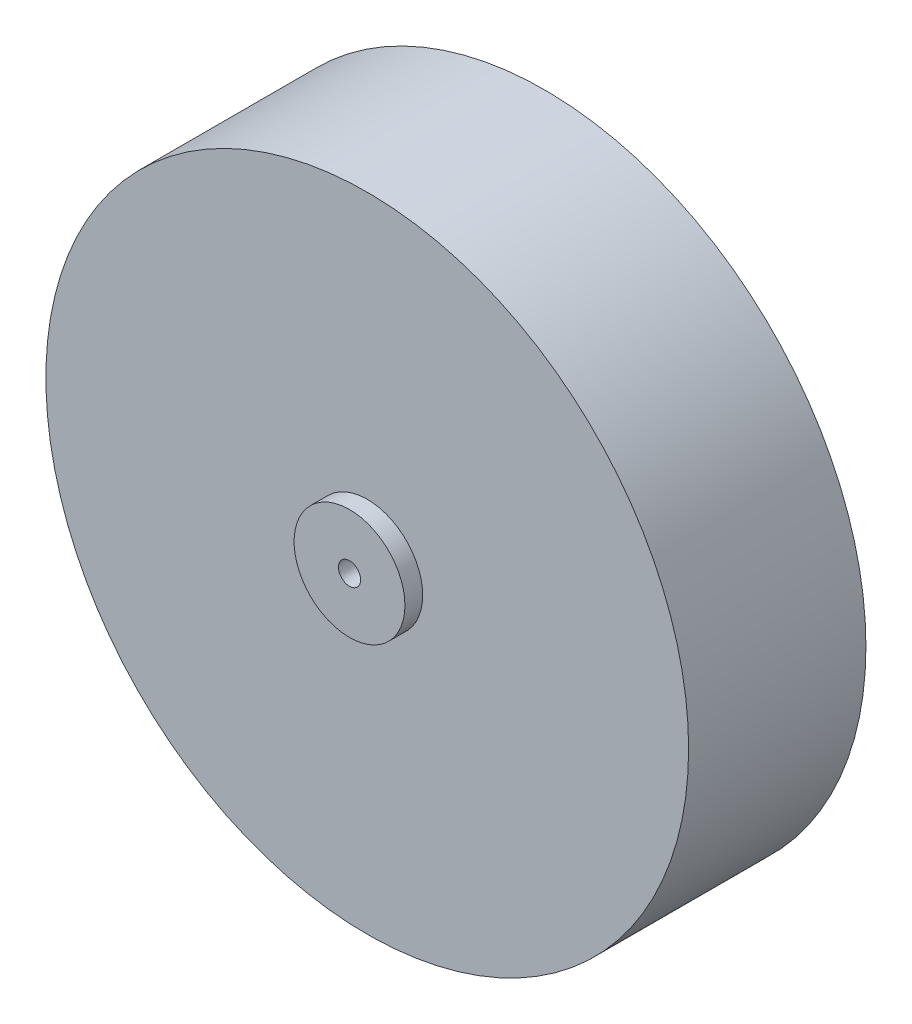
ISO-10303-21;
HEADER;
FILE_DESCRIPTION(('STEP AP214'),'2;1');
FILE_NAME('part.step','',(''),(''),'','','');
FILE_SCHEMA(('AUTOMOTIVE_DESIGN { 1 0 10303 214 1 1 1 1 }'));
ENDSEC;
DATA;
#1=APPLICATION_CONTEXT('core data for automotive mechanical design processes');
#2=APPLICATION_PROTOCOL_DEFINITION('international standard','automotive_design',2000,#1);
#3=PRODUCT_CONTEXT('',#1,'mechanical');
#4=PRODUCT('Part','Part','',(#3));
#5=PRODUCT_RELATED_PRODUCT_CATEGORY('part','',(#4));
#6=PRODUCT_DEFINITION_FORMATION('','',#4);
#7=PRODUCT_DEFINITION_CONTEXT('part definition',#1,'design');
#8=PRODUCT_DEFINITION('design','',#6,#7);
#9=PRODUCT_DEFINITION_SHAPE('','',#8);
#10=(LENGTH_UNIT() NAMED_UNIT(*) SI_UNIT(.MILLI.,.METRE.));
#11=(NAMED_UNIT(*) PLANE_ANGLE_UNIT() SI_UNIT($,.RADIAN.));
#12=(NAMED_UNIT(*) SI_UNIT($,.STERADIAN.) SOLID_ANGLE_UNIT());
#13=UNCERTAINTY_MEASURE_WITH_UNIT(LENGTH_MEASURE(1.E-05),#10,'distance_accuracy_value','');
#14=(GEOMETRIC_REPRESENTATION_CONTEXT(3) GLOBAL_UNCERTAINTY_ASSIGNED_CONTEXT((#13)) GLOBAL_UNIT_ASSIGNED_CONTEXT((#10,
#11,#12)) REPRESENTATION_CONTEXT('',''));
#15=CARTESIAN_POINT('',(0.,0.,0.));
#16=DIRECTION('',(0.,0.,1.));
#17=DIRECTION('',(1.,0.,0.));
#18=AXIS2_PLACEMENT_3D('',#15,#16,#17);
#19=CARTESIAN_POINT('',(0.,0.,20.));
#20=DIRECTION('',(0.,0.,-1.));
#21=DIRECTION('',(-1.,0.,0.));
#22=AXIS2_PLACEMENT_3D('',#19,#20,#21);
#23=CYLINDRICAL_SURFACE('',#22,72.5);
#24=CARTESIAN_POINT('',(0.,0.,20.));
#25=DIRECTION('',(0.,0.,1.));
#26=DIRECTION('',(1.,0.,0.));
#27=AXIS2_PLACEMENT_3D('',#24,#25,#26);
#28=CIRCLE('',#27,72.5);
#29=CARTESIAN_POINT('',(72.5,0.,20.));
#30=VERTEX_POINT('',#29);
#31=EDGE_CURVE('E47',#30,#30,#28,.T.);
#32=ORIENTED_EDGE('',*,*,#31,.F.);
#33=EDGE_LOOP('',(#32));
#34=FACE_BOUND('',#33,.T.);
#35=CARTESIAN_POINT('',(0.,0.,-20.));
#36=DIRECTION('',(0.,0.,1.));
#37=DIRECTION('',(1.,0.,0.));
#38=AXIS2_PLACEMENT_3D('',#35,#36,#37);
#39=CIRCLE('',#38,72.5);
#40=CARTESIAN_POINT('',(72.5,0.,-20.));
#41=VERTEX_POINT('',#40);
#42=EDGE_CURVE('E42',#41,#41,#39,.T.);
#43=ORIENTED_EDGE('',*,*,#42,.T.);
#44=EDGE_LOOP('',(#43));
#45=FACE_BOUND('',#44,.T.);
#46=ADVANCED_FACE('F39',(#34,#45),#23,.T.);
#47=CARTESIAN_POINT('',(0.,0.,20.));
#48=DIRECTION('',(0.,0.,1.));
#49=DIRECTION('',(1.,0.,0.));
#50=AXIS2_PLACEMENT_3D('',#47,#48,#49);
#51=PLANE('',#50);
#52=CARTESIAN_POINT('',(0.,0.,20.));
#53=DIRECTION('',(0.,0.,1.));
#54=DIRECTION('',(1.,0.,0.));
#55=AXIS2_PLACEMENT_3D('',#52,#53,#54);
#56=CIRCLE('',#55,12.5);
#57=CARTESIAN_POINT('',(12.5,0.,20.));
#58=VERTEX_POINT('',#57);
#59=EDGE_CURVE('E10',#58,#58,#56,.T.);
#60=ORIENTED_EDGE('',*,*,#59,.F.);
#61=EDGE_LOOP('',(#60));
#62=FACE_BOUND('',#61,.T.);
#63=ORIENTED_EDGE('',*,*,#31,.T.);
#64=EDGE_LOOP('',(#63));
#65=FACE_BOUND('',#64,.T.);
#66=ADVANCED_FACE('F94',(#62,#65),#51,.T.);
#67=CARTESIAN_POINT('',(0.,0.,-20.));
#68=DIRECTION('',(0.,0.,1.));
#69=DIRECTION('',(1.,0.,0.));
#70=AXIS2_PLACEMENT_3D('',#67,#68,#69);
#71=PLANE('',#70);
#72=CARTESIAN_POINT('',(0.,0.,-20.));
#73=DIRECTION('',(0.,0.,1.));
#74=DIRECTION('',(1.,0.,0.));
#75=AXIS2_PLACEMENT_3D('',#72,#73,#74);
#76=CIRCLE('',#75,12.5);
#77=CARTESIAN_POINT('',(12.5,0.,-20.));
#78=VERTEX_POINT('',#77);
#79=EDGE_CURVE('E59',#78,#78,#76,.T.);
#80=ORIENTED_EDGE('',*,*,#79,.T.);
#81=EDGE_LOOP('',(#80));
#82=FACE_BOUND('',#81,.T.);
#83=ORIENTED_EDGE('',*,*,#42,.F.);
#84=EDGE_LOOP('',(#83));
#85=FACE_BOUND('',#84,.T.);
#86=ADVANCED_FACE('F90',(#82,#85),#71,.F.);
#87=CARTESIAN_POINT('',(0.,0.,24.));
#88=DIRECTION('',(0.,0.,-1.));
#89=DIRECTION('',(-1.,0.,0.));
#90=AXIS2_PLACEMENT_3D('',#87,#88,#89);
#91=CYLINDRICAL_SURFACE('',#90,12.5);
#92=CARTESIAN_POINT('',(0.,0.,24.));
#93=DIRECTION('',(0.,0.,1.));
#94=DIRECTION('',(1.,0.,0.));
#95=AXIS2_PLACEMENT_3D('',#92,#93,#94);
#96=CIRCLE('',#95,12.5);
#97=CARTESIAN_POINT('',(12.5,0.,24.));
#98=VERTEX_POINT('',#97);
#99=EDGE_CURVE('E54',#98,#98,#96,.T.);
#100=ORIENTED_EDGE('',*,*,#99,.F.);
#101=EDGE_LOOP('',(#100));
#102=FACE_BOUND('',#101,.T.);
#103=ORIENTED_EDGE('',*,*,#59,.T.);
#104=EDGE_LOOP('',(#103));
#105=FACE_BOUND('',#104,.T.);
#106=ADVANCED_FACE('F93',(#102,#105),#91,.T.);
#107=CARTESIAN_POINT('',(0.,0.,24.));
#108=DIRECTION('',(0.,0.,1.));
#109=DIRECTION('',(1.,0.,0.));
#110=AXIS2_PLACEMENT_3D('',#107,#108,#109);
#111=PLANE('',#110);
#112=CARTESIAN_POINT('',(0.,0.,24.));
#113=DIRECTION('',(0.,0.,1.));
#114=DIRECTION('',(1.,0.,0.));
#115=AXIS2_PLACEMENT_3D('',#112,#113,#114);
#116=CIRCLE('',#115,2.5);
#117=CARTESIAN_POINT('',(2.5,0.,24.));
#118=VERTEX_POINT('',#117);
#119=EDGE_CURVE('E67',#118,#118,#116,.T.);
#120=ORIENTED_EDGE('',*,*,#119,.F.);
#121=EDGE_LOOP('',(#120));
#122=FACE_BOUND('',#121,.T.);
#123=ORIENTED_EDGE('',*,*,#99,.T.);
#124=EDGE_LOOP('',(#123));
#125=FACE_BOUND('',#124,.T.);
#126=ADVANCED_FACE('F86',(#122,#125),#111,.T.);
#127=CARTESIAN_POINT('',(0.,0.,-24.));
#128=DIRECTION('',(0.,0.,1.));
#129=DIRECTION('',(1.,0.,0.));
#130=AXIS2_PLACEMENT_3D('',#127,#128,#129);
#131=CYLINDRICAL_SURFACE('',#130,12.5);
#132=CARTESIAN_POINT('',(0.,0.,-24.));
#133=DIRECTION('',(0.,0.,1.));
#134=DIRECTION('',(1.,0.,0.));
#135=AXIS2_PLACEMENT_3D('',#132,#133,#134);
#136=CIRCLE('',#135,12.5);
#137=CARTESIAN_POINT('',(12.5,0.,-24.));
#138=VERTEX_POINT('',#137);
#139=EDGE_CURVE('E58',#138,#138,#136,.T.);
#140=ORIENTED_EDGE('',*,*,#139,.T.);
#141=EDGE_LOOP('',(#140));
#142=FACE_BOUND('',#141,.T.);
#143=ORIENTED_EDGE('',*,*,#79,.F.);
#144=EDGE_LOOP('',(#143));
#145=FACE_BOUND('',#144,.T.);
#146=ADVANCED_FACE('F80',(#142,#145),#131,.T.);
#147=CARTESIAN_POINT('',(0.,0.,-24.));
#148=DIRECTION('',(0.,0.,-1.));
#149=DIRECTION('',(1.,0.,0.));
#150=AXIS2_PLACEMENT_3D('',#147,#148,#149);
#151=PLANE('',#150);
#152=CARTESIAN_POINT('',(0.,0.,-24.));
#153=DIRECTION('',(0.,0.,-1.));
#154=DIRECTION('',(-1.,0.,0.));
#155=AXIS2_PLACEMENT_3D('',#152,#153,#154);
#156=CIRCLE('',#155,2.5);
#157=CARTESIAN_POINT('',(-2.5,0.,-24.));
#158=VERTEX_POINT('',#157);
#159=EDGE_CURVE('E63',#158,#158,#156,.T.);
#160=ORIENTED_EDGE('',*,*,#159,.F.);
#161=EDGE_LOOP('',(#160));
#162=FACE_BOUND('',#161,.T.);
#163=ORIENTED_EDGE('',*,*,#139,.F.);
#164=EDGE_LOOP('',(#163));
#165=FACE_BOUND('',#164,.T.);
#166=ADVANCED_FACE('F77',(#162,#165),#151,.T.);
#167=CARTESIAN_POINT('',(0.,0.,-24.));
#168=DIRECTION('',(0.,0.,1.));
#169=DIRECTION('',(1.,0.,0.));
#170=AXIS2_PLACEMENT_3D('',#167,#168,#169);
#171=CYLINDRICAL_SURFACE('',#170,2.5);
#172=ORIENTED_EDGE('',*,*,#119,.T.);
#173=EDGE_LOOP('',(#172));
#174=FACE_BOUND('',#173,.T.);
#175=ORIENTED_EDGE('',*,*,#159,.T.);
#176=EDGE_LOOP('',(#175));
#177=FACE_BOUND('',#176,.T.);
#178=ADVANCED_FACE('F75',(#174,#177),#171,.F.);
#179=CLOSED_SHELL('',(#46,#66,#86,#106,#126,#146,#166,#178));
#180=MANIFOLD_SOLID_BREP('B2',#179);
#181=ADVANCED_BREP_SHAPE_REPRESENTATION('',(#18,#180),#14);
#182=SHAPE_DEFINITION_REPRESENTATION(#9,#181);
ENDSEC;
END-ISO-10303-21;
